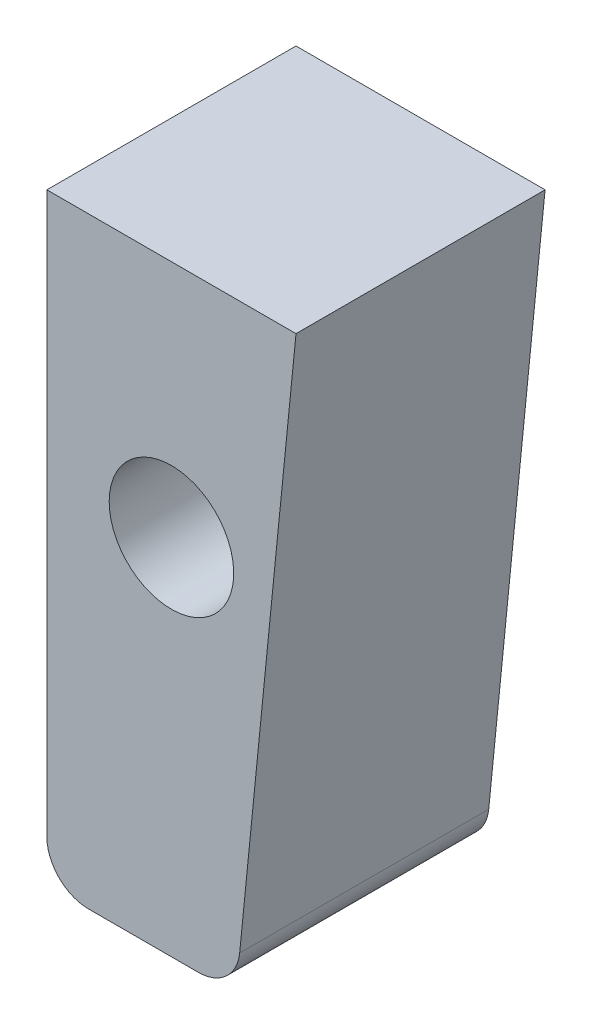
ISO-10303-21;
HEADER;
FILE_DESCRIPTION(('STEP AP214'),'2;1');
FILE_NAME('part.step','',(''),(''),'','','');
FILE_SCHEMA(('AUTOMOTIVE_DESIGN { 1 0 10303 214 1 1 1 1 }'));
ENDSEC;
DATA;
#1=APPLICATION_CONTEXT('core data for automotive mechanical design processes');
#2=APPLICATION_PROTOCOL_DEFINITION('international standard','automotive_design',2000,#1);
#3=PRODUCT_CONTEXT('',#1,'mechanical');
#4=PRODUCT('Part','Part','',(#3));
#5=PRODUCT_RELATED_PRODUCT_CATEGORY('part','',(#4));
#6=PRODUCT_DEFINITION_FORMATION('','',#4);
#7=PRODUCT_DEFINITION_CONTEXT('part definition',#1,'design');
#8=PRODUCT_DEFINITION('design','',#6,#7);
#9=PRODUCT_DEFINITION_SHAPE('','',#8);
#10=(LENGTH_UNIT() NAMED_UNIT(*) SI_UNIT(.MILLI.,.METRE.));
#11=(NAMED_UNIT(*) PLANE_ANGLE_UNIT() SI_UNIT($,.RADIAN.));
#12=(NAMED_UNIT(*) SI_UNIT($,.STERADIAN.) SOLID_ANGLE_UNIT());
#13=UNCERTAINTY_MEASURE_WITH_UNIT(LENGTH_MEASURE(1.E-05),#10,'distance_accuracy_value','');
#14=(GEOMETRIC_REPRESENTATION_CONTEXT(3) GLOBAL_UNCERTAINTY_ASSIGNED_CONTEXT((#13)) GLOBAL_UNIT_ASSIGNED_CONTEXT((#10,
#11,#12)) REPRESENTATION_CONTEXT('',''));
#15=CARTESIAN_POINT('',(0.,0.,0.));
#16=DIRECTION('',(0.,0.,1.));
#17=DIRECTION('',(1.,0.,0.));
#18=AXIS2_PLACEMENT_3D('',#15,#16,#17);
#19=CARTESIAN_POINT('',(0.,736.6,0.));
#20=DIRECTION('',(1.,0.,0.));
#21=DIRECTION('',(0.,0.,-1.));
#22=AXIS2_PLACEMENT_3D('',#19,#20,#21);
#23=PLANE('',#22);
#24=DIRECTION('',(0.,-1.,0.));
#25=VECTOR('',#24,1.);
#26=CARTESIAN_POINT('',(0.,736.6,-304.8));
#27=LINE('',#26,#25);
#28=CARTESIAN_POINT('',(0.,736.6,-304.8));
#29=VERTEX_POINT('',#28);
#30=CARTESIAN_POINT('',(0.,50.8,-304.8));
#31=VERTEX_POINT('',#30);
#32=EDGE_CURVE('E108',#29,#31,#27,.T.);
#33=ORIENTED_EDGE('',*,*,#32,.T.);
#34=DIRECTION('',(0.,0.,1.));
#35=VECTOR('',#34,1.);
#36=CARTESIAN_POINT('',(0.,50.8,0.));
#37=LINE('',#36,#35);
#38=CARTESIAN_POINT('',(0.,50.8,0.));
#39=VERTEX_POINT('',#38);
#40=EDGE_CURVE('E124',#31,#39,#37,.T.);
#41=ORIENTED_EDGE('',*,*,#40,.T.);
#42=DIRECTION('',(0.,-1.,0.));
#43=VECTOR('',#42,1.);
#44=CARTESIAN_POINT('',(0.,736.6,0.));
#45=LINE('',#44,#43);
#46=CARTESIAN_POINT('',(0.,736.6,0.));
#47=VERTEX_POINT('',#46);
#48=EDGE_CURVE('E111',#47,#39,#45,.T.);
#49=ORIENTED_EDGE('',*,*,#48,.F.);
#50=DIRECTION('',(0.,0.,1.));
#51=VECTOR('',#50,1.);
#52=CARTESIAN_POINT('',(0.,736.6,0.));
#53=LINE('',#52,#51);
#54=EDGE_CURVE('E120',#29,#47,#53,.T.);
#55=ORIENTED_EDGE('',*,*,#54,.F.);
#56=EDGE_LOOP('',(#33,#41,#49,#55));
#57=FACE_BOUND('',#56,.T.);
#58=ADVANCED_FACE('F33',(#57),#23,.F.);
#59=CARTESIAN_POINT('',(0.,736.6,0.));
#60=DIRECTION('',(0.,0.,-1.));
#61=DIRECTION('',(-1.,0.,0.));
#62=AXIS2_PLACEMENT_3D('',#59,#60,#61);
#63=PLANE('',#62);
#64=CARTESIAN_POINT('',(152.4,444.5,0.));
#65=DIRECTION('',(0.,0.,-1.));
#66=DIRECTION('',(-1.,0.,0.));
#67=AXIS2_PLACEMENT_3D('',#64,#65,#66);
#68=CIRCLE('',#67,76.2);
#69=CARTESIAN_POINT('',(76.2,444.5,0.));
#70=VERTEX_POINT('',#69);
#71=EDGE_CURVE('E119',#70,#70,#68,.F.);
#72=ORIENTED_EDGE('',*,*,#71,.F.);
#73=EDGE_LOOP('',(#72));
#74=FACE_BOUND('',#73,.T.);
#75=ORIENTED_EDGE('',*,*,#48,.T.);
#76=CARTESIAN_POINT('',(50.8,50.8,0.));
#77=DIRECTION('',(0.,0.,-1.));
#78=DIRECTION('',(-1.,0.,0.));
#79=AXIS2_PLACEMENT_3D('',#76,#77,#78);
#80=CIRCLE('',#79,50.8);
#81=CARTESIAN_POINT('',(50.8,0.,0.));
#82=VERTEX_POINT('',#81);
#83=EDGE_CURVE('E129',#39,#82,#80,.F.);
#84=ORIENTED_EDGE('',*,*,#83,.T.);
#85=DIRECTION('',(1.,0.,0.));
#86=VECTOR('',#85,1.);
#87=CARTESIAN_POINT('',(0.,0.,0.));
#88=LINE('',#87,#86);
#89=CARTESIAN_POINT('',(185.297542567109,0.,0.));
#90=VERTEX_POINT('',#89);
#91=EDGE_CURVE('E115',#82,#90,#88,.T.);
#92=ORIENTED_EDGE('',*,*,#91,.T.);
#93=CARTESIAN_POINT('',(185.297542567109,50.8,0.));
#94=DIRECTION('',(0.,0.,-1.));
#95=DIRECTION('',(-1.,0.,0.));
#96=AXIS2_PLACEMENT_3D('',#93,#94,#95);
#97=CIRCLE('',#96,50.8);
#98=CARTESIAN_POINT('',(235.846379317557,45.7546949372225,0.));
#99=VERTEX_POINT('',#98);
#100=EDGE_CURVE('E127',#90,#99,#97,.F.);
#101=ORIENTED_EDGE('',*,*,#100,.T.);
#102=DIRECTION('',(-0.0993170287948285,-0.995055841544266,0.));
#103=VECTOR('',#102,1.);
#104=CARTESIAN_POINT('',(304.8,736.6,0.));
#105=LINE('',#104,#103);
#106=CARTESIAN_POINT('',(304.8,736.6,0.));
#107=VERTEX_POINT('',#106);
#108=EDGE_CURVE('E96',#107,#99,#105,.T.);
#109=ORIENTED_EDGE('',*,*,#108,.F.);
#110=DIRECTION('',(1.,0.,0.));
#111=VECTOR('',#110,1.);
#112=CARTESIAN_POINT('',(0.,736.6,0.));
#113=LINE('',#112,#111);
#114=EDGE_CURVE('E104',#47,#107,#113,.T.);
#115=ORIENTED_EDGE('',*,*,#114,.F.);
#116=EDGE_LOOP('',(#75,#84,#92,#101,#109,#115));
#117=FACE_BOUND('',#116,.T.);
#118=ADVANCED_FACE('F141',(#74,#117),#63,.F.);
#119=CARTESIAN_POINT('',(0.,736.6,-304.8));
#120=DIRECTION('',(0.,0.,1.));
#121=DIRECTION('',(1.,0.,0.));
#122=AXIS2_PLACEMENT_3D('',#119,#120,#121);
#123=PLANE('',#122);
#124=CARTESIAN_POINT('',(152.4,444.5,-304.8));
#125=DIRECTION('',(0.,0.,-1.));
#126=DIRECTION('',(-1.,0.,0.));
#127=AXIS2_PLACEMENT_3D('',#124,#125,#126);
#128=CIRCLE('',#127,76.2);
#129=CARTESIAN_POINT('',(76.2,444.5,-304.8));
#130=VERTEX_POINT('',#129);
#131=EDGE_CURVE('E95',#130,#130,#128,.T.);
#132=ORIENTED_EDGE('',*,*,#131,.F.);
#133=EDGE_LOOP('',(#132));
#134=FACE_BOUND('',#133,.T.);
#135=DIRECTION('',(-1.,0.,0.));
#136=VECTOR('',#135,1.);
#137=CARTESIAN_POINT('',(0.,0.,-304.8));
#138=LINE('',#137,#136);
#139=CARTESIAN_POINT('',(185.297542567109,0.,-304.8));
#140=VERTEX_POINT('',#139);
#141=CARTESIAN_POINT('',(50.8,0.,-304.8));
#142=VERTEX_POINT('',#141);
#143=EDGE_CURVE('E118',#140,#142,#138,.T.);
#144=ORIENTED_EDGE('',*,*,#143,.T.);
#145=CARTESIAN_POINT('',(50.8,50.8,-304.8));
#146=DIRECTION('',(0.,0.,1.));
#147=DIRECTION('',(1.,0.,0.));
#148=AXIS2_PLACEMENT_3D('',#145,#146,#147);
#149=CIRCLE('',#148,50.8);
#150=EDGE_CURVE('E41',#142,#31,#149,.F.);
#151=ORIENTED_EDGE('',*,*,#150,.T.);
#152=ORIENTED_EDGE('',*,*,#32,.F.);
#153=DIRECTION('',(-1.,0.,0.));
#154=VECTOR('',#153,1.);
#155=CARTESIAN_POINT('',(0.,736.6,-304.8));
#156=LINE('',#155,#154);
#157=CARTESIAN_POINT('',(304.8,736.6,-304.8));
#158=VERTEX_POINT('',#157);
#159=EDGE_CURVE('E102',#158,#29,#156,.T.);
#160=ORIENTED_EDGE('',*,*,#159,.F.);
#161=DIRECTION('',(0.0993170287948285,0.995055841544266,0.));
#162=VECTOR('',#161,1.);
#163=CARTESIAN_POINT('',(304.8,736.6,-304.8));
#164=LINE('',#163,#162);
#165=CARTESIAN_POINT('',(235.846379317557,45.7546949372227,-304.8));
#166=VERTEX_POINT('',#165);
#167=EDGE_CURVE('E87',#166,#158,#164,.T.);
#168=ORIENTED_EDGE('',*,*,#167,.F.);
#169=CARTESIAN_POINT('',(185.297542567109,50.8,-304.8));
#170=DIRECTION('',(0.,0.,1.));
#171=DIRECTION('',(1.,0.,0.));
#172=AXIS2_PLACEMENT_3D('',#169,#170,#171);
#173=CIRCLE('',#172,50.8);
#174=EDGE_CURVE('E48',#166,#140,#173,.F.);
#175=ORIENTED_EDGE('',*,*,#174,.T.);
#176=EDGE_LOOP('',(#144,#151,#152,#160,#168,#175));
#177=FACE_BOUND('',#176,.T.);
#178=ADVANCED_FACE('F106',(#134,#177),#123,.F.);
#179=CARTESIAN_POINT('',(0.,736.6,0.));
#180=DIRECTION('',(0.,-1.,0.));
#181=DIRECTION('',(0.,0.,-1.));
#182=AXIS2_PLACEMENT_3D('',#179,#180,#181);
#183=PLANE('',#182);
#184=ORIENTED_EDGE('',*,*,#54,.T.);
#185=ORIENTED_EDGE('',*,*,#114,.T.);
#186=DIRECTION('',(0.,0.,-1.));
#187=VECTOR('',#186,1.);
#188=CARTESIAN_POINT('',(304.8,736.6,0.));
#189=LINE('',#188,#187);
#190=EDGE_CURVE('E91',#107,#158,#189,.T.);
#191=ORIENTED_EDGE('',*,*,#190,.T.);
#192=ORIENTED_EDGE('',*,*,#159,.T.);
#193=EDGE_LOOP('',(#184,#185,#191,#192));
#194=FACE_BOUND('',#193,.T.);
#195=ADVANCED_FACE('F101',(#194),#183,.F.);
#196=CARTESIAN_POINT('',(0.,0.,0.));
#197=DIRECTION('',(0.,-1.,0.));
#198=DIRECTION('',(0.,0.,-1.));
#199=AXIS2_PLACEMENT_3D('',#196,#197,#198);
#200=PLANE('',#199);
#201=ORIENTED_EDGE('',*,*,#91,.F.);
#202=DIRECTION('',(0.,0.,1.));
#203=VECTOR('',#202,1.);
#204=CARTESIAN_POINT('',(50.8,0.,-304.8));
#205=LINE('',#204,#203);
#206=EDGE_CURVE('E55',#82,#142,#205,.F.);
#207=ORIENTED_EDGE('',*,*,#206,.T.);
#208=ORIENTED_EDGE('',*,*,#143,.F.);
#209=DIRECTION('',(0.,0.,-1.));
#210=VECTOR('',#209,1.);
#211=CARTESIAN_POINT('',(185.297542567109,0.,0.));
#212=LINE('',#211,#210);
#213=EDGE_CURVE('E131',#140,#90,#212,.F.);
#214=ORIENTED_EDGE('',*,*,#213,.T.);
#215=EDGE_LOOP('',(#201,#207,#208,#214));
#216=FACE_BOUND('',#215,.T.);
#217=ADVANCED_FACE('F143',(#216),#200,.T.);
#218=CARTESIAN_POINT('',(304.8,736.6,0.000999999999973245));
#219=DIRECTION('',(-0.995055841544266,0.0993170287948285,0.));
#220=DIRECTION('',(-0.0993170287948285,-0.995055841544266,0.));
#221=AXIS2_PLACEMENT_3D('',#218,#219,#220);
#222=PLANE('',#221);
#223=ORIENTED_EDGE('',*,*,#108,.T.);
#224=DIRECTION('',(0.,0.,-1.));
#225=VECTOR('',#224,1.);
#226=CARTESIAN_POINT('',(235.846379317557,45.7546949372227,-304.8));
#227=LINE('',#226,#225);
#228=EDGE_CURVE('E11',#99,#166,#227,.T.);
#229=ORIENTED_EDGE('',*,*,#228,.T.);
#230=ORIENTED_EDGE('',*,*,#167,.T.);
#231=ORIENTED_EDGE('',*,*,#190,.F.);
#232=EDGE_LOOP('',(#223,#229,#230,#231));
#233=FACE_BOUND('',#232,.T.);
#234=ADVANCED_FACE('F90',(#233),#222,.F.);
#235=CARTESIAN_POINT('',(152.4,444.5,0.000999999999973245));
#236=DIRECTION('',(0.,0.,-1.));
#237=DIRECTION('',(-1.,0.,0.));
#238=AXIS2_PLACEMENT_3D('',#235,#236,#237);
#239=CYLINDRICAL_SURFACE('',#238,76.2);
#240=CARTESIAN_POINT('',(76.2,444.5,-304.8));
#241=CARTESIAN_POINT('',(76.2,444.5,-301.625));
#242=CARTESIAN_POINT('',(76.2,444.5,-298.45));
#243=CARTESIAN_POINT('',(76.2,444.5,-292.1));
#244=CARTESIAN_POINT('',(76.2,444.5,-288.925));
#245=CARTESIAN_POINT('',(76.2,444.5,-282.575));
#246=CARTESIAN_POINT('',(76.2,444.5,-279.4));
#247=CARTESIAN_POINT('',(76.2,444.5,-273.05));
#248=CARTESIAN_POINT('',(76.2,444.5,-269.875));
#249=CARTESIAN_POINT('',(76.2,444.5,-263.525));
#250=CARTESIAN_POINT('',(76.2,444.5,-260.35));
#251=CARTESIAN_POINT('',(76.2,444.5,-254.));
#252=CARTESIAN_POINT('',(76.2,444.5,-250.825));
#253=CARTESIAN_POINT('',(76.2,444.5,-244.475));
#254=CARTESIAN_POINT('',(76.2,444.5,-241.3));
#255=CARTESIAN_POINT('',(76.2,444.5,-234.95));
#256=CARTESIAN_POINT('',(76.2,444.5,-231.775));
#257=CARTESIAN_POINT('',(76.2,444.5,-225.425));
#258=CARTESIAN_POINT('',(76.2,444.5,-222.25));
#259=CARTESIAN_POINT('',(76.2,444.5,-215.9));
#260=CARTESIAN_POINT('',(76.2,444.5,-212.725));
#261=CARTESIAN_POINT('',(76.2,444.5,-206.375));
#262=CARTESIAN_POINT('',(76.2,444.5,-203.2));
#263=CARTESIAN_POINT('',(76.2,444.5,-196.85));
#264=CARTESIAN_POINT('',(76.2,444.5,-193.675));
#265=CARTESIAN_POINT('',(76.2,444.5,-187.325));
#266=CARTESIAN_POINT('',(76.2,444.5,-184.15));
#267=CARTESIAN_POINT('',(76.2,444.5,-177.8));
#268=CARTESIAN_POINT('',(76.2,444.5,-174.625));
#269=CARTESIAN_POINT('',(76.2,444.5,-168.275));
#270=CARTESIAN_POINT('',(76.2,444.5,-165.1));
#271=CARTESIAN_POINT('',(76.2,444.5,-158.75));
#272=CARTESIAN_POINT('',(76.2,444.5,-155.575));
#273=CARTESIAN_POINT('',(76.2,444.5,-149.225));
#274=CARTESIAN_POINT('',(76.2,444.5,-146.05));
#275=CARTESIAN_POINT('',(76.2,444.5,-139.7));
#276=CARTESIAN_POINT('',(76.2,444.5,-136.525));
#277=CARTESIAN_POINT('',(76.2,444.5,-130.175));
#278=CARTESIAN_POINT('',(76.2,444.5,-127.));
#279=CARTESIAN_POINT('',(76.2,444.5,-120.65));
#280=CARTESIAN_POINT('',(76.2,444.5,-117.475));
#281=CARTESIAN_POINT('',(76.2,444.5,-111.125));
#282=CARTESIAN_POINT('',(76.2,444.5,-107.95));
#283=CARTESIAN_POINT('',(76.2,444.5,-101.6));
#284=CARTESIAN_POINT('',(76.2,444.5,-98.425));
#285=CARTESIAN_POINT('',(76.2,444.5,-92.075));
#286=CARTESIAN_POINT('',(76.2,444.5,-88.9));
#287=CARTESIAN_POINT('',(76.2,444.5,-82.55));
#288=CARTESIAN_POINT('',(76.2,444.5,-79.375));
#289=CARTESIAN_POINT('',(76.2,444.5,-73.025));
#290=CARTESIAN_POINT('',(76.2,444.5,-69.85));
#291=CARTESIAN_POINT('',(76.2,444.5,-63.5));
#292=CARTESIAN_POINT('',(76.2,444.5,-60.325));
#293=CARTESIAN_POINT('',(76.2,444.5,-53.975));
#294=CARTESIAN_POINT('',(76.2,444.5,-50.8));
#295=CARTESIAN_POINT('',(76.2,444.5,-44.45));
#296=CARTESIAN_POINT('',(76.2,444.5,-41.275));
#297=CARTESIAN_POINT('',(76.2,444.5,-34.925));
#298=CARTESIAN_POINT('',(76.2,444.5,-31.75));
#299=CARTESIAN_POINT('',(76.2,444.5,-25.4));
#300=CARTESIAN_POINT('',(76.2,444.5,-22.225));
#301=CARTESIAN_POINT('',(76.2,444.5,-15.875));
#302=CARTESIAN_POINT('',(76.2,444.5,-12.7));
#303=CARTESIAN_POINT('',(76.2,444.5,-6.35));
#304=CARTESIAN_POINT('',(76.2,444.5,-3.175));
#305=CARTESIAN_POINT('',(76.2,444.5,0.));
#306=B_SPLINE_CURVE_WITH_KNOTS('',3,(#240,#241,#242,#243,#244,#245,#246,#247,#248,#249,#250,
#251,#252,#253,#254,#255,#256,#257,#258,#259,#260,#261,#262,#263,#264,#265,#266,#267,#268,#269,
#270,#271,#272,#273,#274,#275,#276,#277,#278,#279,#280,#281,#282,#283,#284,#285,#286,#287,#288,
#289,#290,#291,#292,#293,#294,#295,#296,#297,#298,#299,#300,#301,#302,#303,#304,#305),
.UNSPECIFIED.,.F.,.F.,(4,2,2,2,2,2,2,2,2,2,2,2,2,2,2,2,2,2,2,2,2,2,2,2,2,2,2,2,2,2,2,2,4),(0.,
9.52500000000001,19.05,28.575,38.1,47.625,57.15,66.675,76.2,85.725,95.25,104.775,114.3,123.825,
133.35,142.875,152.4,161.925,171.45,180.975,190.5,200.025,209.55,219.075,228.6,238.125,247.65,
257.175,266.7,276.225,285.75,295.275,304.8),.UNSPECIFIED.);
#307=EDGE_CURVE('BSEAM152',#130,#70,#306,.T.);
#308=ORIENTED_EDGE('',*,*,#131,.T.);
#309=ORIENTED_EDGE('',*,*,#71,.T.);
#310=ORIENTED_EDGE('',*,*,#307,.T.);
#311=ORIENTED_EDGE('',*,*,#307,.F.);
#312=EDGE_LOOP('',(#308,#310,#309,#311));
#313=FACE_BOUND('',#312,.T.);
#314=ADVANCED_FACE('F152',(#313),#239,.F.);
#315=CARTESIAN_POINT('',(50.8,50.8,0.));
#316=DIRECTION('',(0.,0.,-1.));
#317=DIRECTION('',(-1.,0.,0.));
#318=AXIS2_PLACEMENT_3D('',#315,#316,#317);
#319=CYLINDRICAL_SURFACE('',#318,50.8);
#320=ORIENTED_EDGE('',*,*,#150,.F.);
#321=ORIENTED_EDGE('',*,*,#206,.F.);
#322=ORIENTED_EDGE('',*,*,#83,.F.);
#323=ORIENTED_EDGE('',*,*,#40,.F.);
#324=EDGE_LOOP('',(#320,#321,#322,#323));
#325=FACE_BOUND('',#324,.T.);
#326=ADVANCED_FACE('F139',(#325),#319,.T.);
#327=CARTESIAN_POINT('',(185.297542567109,50.8,0.000999999999973245));
#328=DIRECTION('',(0.,0.,1.));
#329=DIRECTION('',(1.,0.,0.));
#330=AXIS2_PLACEMENT_3D('',#327,#328,#329);
#331=CYLINDRICAL_SURFACE('',#330,50.8);
#332=ORIENTED_EDGE('',*,*,#100,.F.);
#333=ORIENTED_EDGE('',*,*,#213,.F.);
#334=ORIENTED_EDGE('',*,*,#174,.F.);
#335=ORIENTED_EDGE('',*,*,#228,.F.);
#336=EDGE_LOOP('',(#332,#333,#334,#335));
#337=FACE_BOUND('',#336,.T.);
#338=ADVANCED_FACE('F35',(#337),#331,.T.);
#339=CLOSED_SHELL('',(#58,#118,#178,#195,#217,#234,#314,#326,#338));
#340=MANIFOLD_SOLID_BREP('B2',#339);
#341=ADVANCED_BREP_SHAPE_REPRESENTATION('',(#18,#340),#14);
#342=SHAPE_DEFINITION_REPRESENTATION(#9,#341);
ENDSEC;
END-ISO-10303-21;
